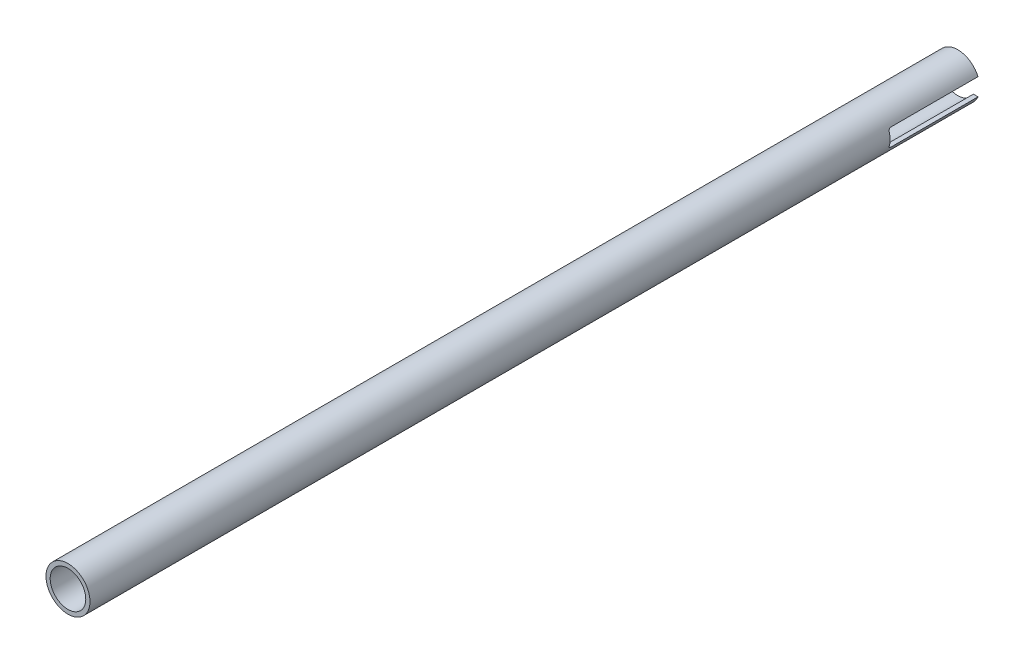
ISO-10303-21;
HEADER;
FILE_DESCRIPTION(('STEP AP214'),'2;1');
FILE_NAME('part.step','',(''),(''),'','','');
FILE_SCHEMA(('AUTOMOTIVE_DESIGN { 1 0 10303 214 1 1 1 1 }'));
ENDSEC;
DATA;
#1=APPLICATION_CONTEXT('core data for automotive mechanical design processes');
#2=APPLICATION_PROTOCOL_DEFINITION('international standard','automotive_design',2000,#1);
#3=PRODUCT_CONTEXT('',#1,'mechanical');
#4=PRODUCT('Part','Part','',(#3));
#5=PRODUCT_RELATED_PRODUCT_CATEGORY('part','',(#4));
#6=PRODUCT_DEFINITION_FORMATION('','',#4);
#7=PRODUCT_DEFINITION_CONTEXT('part definition',#1,'design');
#8=PRODUCT_DEFINITION('design','',#6,#7);
#9=PRODUCT_DEFINITION_SHAPE('','',#8);
#10=(LENGTH_UNIT() NAMED_UNIT(*) SI_UNIT(.MILLI.,.METRE.));
#11=(NAMED_UNIT(*) PLANE_ANGLE_UNIT() SI_UNIT($,.RADIAN.));
#12=(NAMED_UNIT(*) SI_UNIT($,.STERADIAN.) SOLID_ANGLE_UNIT());
#13=UNCERTAINTY_MEASURE_WITH_UNIT(LENGTH_MEASURE(1.E-05),#10,'distance_accuracy_value','');
#14=(GEOMETRIC_REPRESENTATION_CONTEXT(3) GLOBAL_UNCERTAINTY_ASSIGNED_CONTEXT((#13)) GLOBAL_UNIT_ASSIGNED_CONTEXT((#10,
#11,#12)) REPRESENTATION_CONTEXT('',''));
#15=CARTESIAN_POINT('',(0.,0.,0.));
#16=DIRECTION('',(0.,0.,1.));
#17=DIRECTION('',(1.,0.,0.));
#18=AXIS2_PLACEMENT_3D('',#15,#16,#17);
#19=CARTESIAN_POINT('',(0.,0.,0.));
#20=DIRECTION('',(0.,0.,1.));
#21=DIRECTION('',(1.,0.,0.));
#22=AXIS2_PLACEMENT_3D('',#19,#20,#21);
#23=PLANE('',#22);
#24=DIRECTION('',(-1.,0.,0.));
#25=VECTOR('',#24,1.);
#26=CARTESIAN_POINT('',(415.80090521024,-3.17500000000001,0.));
#27=LINE('',#26,#25);
#28=CARTESIAN_POINT('',(7.34407080575888,-3.17500000000001,0.));
#29=VERTEX_POINT('',#28);
#30=CARTESIAN_POINT('',(5.64543213580679,-3.17500000000001,0.));
#31=VERTEX_POINT('',#30);
#32=EDGE_CURVE('E70',#29,#31,#27,.T.);
#33=ORIENTED_EDGE('',*,*,#32,.F.);
#34=CARTESIAN_POINT('',(0.,0.,0.));
#35=DIRECTION('',(0.,0.,1.));
#36=DIRECTION('',(1.,0.,0.));
#37=AXIS2_PLACEMENT_3D('',#34,#35,#36);
#38=CIRCLE('',#37,8.001);
#39=CARTESIAN_POINT('',(-7.34407080575888,-3.17500000000001,0.));
#40=VERTEX_POINT('',#39);
#41=EDGE_CURVE('E161',#40,#29,#38,.T.);
#42=ORIENTED_EDGE('',*,*,#41,.F.);
#43=CARTESIAN_POINT('',(-5.64543213580676,-3.17500000000001,0.));
#44=VERTEX_POINT('',#43);
#45=EDGE_CURVE('E155',#44,#40,#27,.T.);
#46=ORIENTED_EDGE('',*,*,#45,.F.);
#47=CARTESIAN_POINT('',(0.,0.,0.));
#48=DIRECTION('',(0.,0.,1.));
#49=DIRECTION('',(1.,0.,0.));
#50=AXIS2_PLACEMENT_3D('',#47,#48,#49);
#51=CIRCLE('',#50,6.477);
#52=EDGE_CURVE('E266',#44,#31,#51,.T.);
#53=ORIENTED_EDGE('',*,*,#52,.T.);
#54=EDGE_LOOP('',(#33,#42,#46,#53));
#55=FACE_BOUND('',#54,.T.);
#56=ADVANCED_FACE('F45',(#55),#23,.F.);
#57=CARTESIAN_POINT('',(0.,0.,323.85));
#58=DIRECTION('',(0.,0.,-1.));
#59=DIRECTION('',(-1.,0.,0.));
#60=AXIS2_PLACEMENT_3D('',#57,#58,#59);
#61=CYLINDRICAL_SURFACE('',#60,8.001);
#62=CARTESIAN_POINT('',(0.,0.,323.85));
#63=DIRECTION('',(0.,0.,1.));
#64=DIRECTION('',(1.,0.,0.));
#65=AXIS2_PLACEMENT_3D('',#62,#63,#64);
#66=CIRCLE('',#65,8.001);
#67=CARTESIAN_POINT('',(8.001,0.,323.85));
#68=VERTEX_POINT('',#67);
#69=EDGE_CURVE('E275',#68,#68,#66,.T.);
#70=ORIENTED_EDGE('',*,*,#69,.F.);
#71=EDGE_LOOP('',(#70));
#72=FACE_BOUND('',#71,.T.);
#73=DIRECTION('',(0.,0.,-1.));
#74=VECTOR('',#73,1.);
#75=CARTESIAN_POINT('',(7.34407080575893,3.17499999999991,323.85));
#76=LINE('',#75,#74);
#77=CARTESIAN_POINT('',(7.34407080575894,3.175,0.));
#78=VERTEX_POINT('',#77);
#79=CARTESIAN_POINT('',(7.34407080575889,3.17499999999999,31.75));
#80=VERTEX_POINT('',#79);
#81=EDGE_CURVE('E260',#78,#80,#76,.F.);
#82=ORIENTED_EDGE('',*,*,#81,.F.);
#83=CARTESIAN_POINT('',(-7.34407080575894,3.175,0.));
#84=VERTEX_POINT('',#83);
#85=EDGE_CURVE('E280',#78,#84,#38,.T.);
#86=ORIENTED_EDGE('',*,*,#85,.T.);
#87=DIRECTION('',(0.,0.,-1.));
#88=VECTOR('',#87,1.);
#89=CARTESIAN_POINT('',(-7.34407080575893,3.17499999999991,323.85));
#90=LINE('',#89,#88);
#91=CARTESIAN_POINT('',(-7.34407080575889,3.17499999999999,31.75));
#92=VERTEX_POINT('',#91);
#93=EDGE_CURVE('E263',#92,#84,#90,.T.);
#94=ORIENTED_EDGE('',*,*,#93,.F.);
#95=CARTESIAN_POINT('',(-7.66747709484678,2.286,32.639));
#96=CARTESIAN_POINT('',(-7.65181817979908,2.3385958419998,32.6390275116819));
#97=CARTESIAN_POINT('',(-7.63558675167447,2.39098952207116,32.6343352251298));
#98=CARTESIAN_POINT('',(-7.60256503069519,2.49396025583239,32.6159066017238));
#99=CARTESIAN_POINT('',(-7.58577496211289,2.54453802198353,32.6021738536421));
#100=CARTESIAN_POINT('',(-7.55220768941947,2.64251174116497,32.5660580815029));
#101=CARTESIAN_POINT('',(-7.53543048621283,2.68990748772698,32.5436744967635));
#102=CARTESIAN_POINT('',(-7.50257725566912,2.78022296401813,32.4908109844895));
#103=CARTESIAN_POINT('',(-7.48650120499677,2.82314284277636,32.4603313266429));
#104=CARTESIAN_POINT('',(-7.45584332386721,2.9031425125085,32.3920404166692));
#105=CARTESIAN_POINT('',(-7.44125812173123,2.94023558815918,32.3542462937625));
#106=CARTESIAN_POINT('',(-7.41435240389723,3.00743958054121,32.2721647461423));
#107=CARTESIAN_POINT('',(-7.40203168420115,3.03755112627436,32.2278779069783));
#108=CARTESIAN_POINT('',(-7.38104682539323,3.08818112668983,32.1365340148327));
#109=CARTESIAN_POINT('',(-7.37222318574828,3.10912427794627,32.0897491729313));
#110=CARTESIAN_POINT('',(-7.35796584765575,3.14271825200318,31.9928425452802));
#111=CARTESIAN_POINT('',(-7.35252605118551,3.15538399361797,31.9427269434158));
#112=CARTESIAN_POINT('',(-7.34735234553181,3.1674009313941,31.8684048584009));
#113=CARTESIAN_POINT('',(-7.34612347725815,3.17024870486015,31.8448170364198));
#114=CARTESIAN_POINT('',(-7.34448285692754,3.17404712520643,31.7974907061118));
#115=CARTESIAN_POINT('',(-7.34407008630743,3.17500013692779,31.773752422764));
#116=CARTESIAN_POINT('',(-7.34407080575889,3.175,31.75));
#117=B_SPLINE_CURVE_WITH_KNOTS('',3,(#95,#96,#97,#98,#99,#100,#101,#102,#103,#104,#105,#106,
#107,#108,#109,#110,#111,#112,#113,#114,#115,#116),.UNSPECIFIED.,.F.,.F.,(4,2,2,2,2,2,2,2,2,2,
4),(0.,0.164387533439112,0.328709849636772,0.493042817755776,0.657370312474114,0.82131753786579,
0.985249986667357,1.14047233460427,1.29541413981368,1.36671002358172,1.43791686737052),.UNSPECIFIED.);
#118=CARTESIAN_POINT('',(-7.66747709484678,2.286,32.639));
#119=VERTEX_POINT('',#118);
#120=EDGE_CURVE('E246',#119,#92,#117,.T.);
#121=ORIENTED_EDGE('',*,*,#120,.F.);
#122=CARTESIAN_POINT('',(0.,0.,32.639));
#123=DIRECTION('',(0.,0.,-1.));
#124=DIRECTION('',(-1.,0.,0.));
#125=AXIS2_PLACEMENT_3D('',#122,#123,#124);
#126=CIRCLE('',#125,8.001);
#127=CARTESIAN_POINT('',(-7.66747709484678,-2.286,32.639));
#128=VERTEX_POINT('',#127);
#129=EDGE_CURVE('E148',#128,#119,#126,.T.);
#130=ORIENTED_EDGE('',*,*,#129,.F.);
#131=CARTESIAN_POINT('',(-7.34407080575888,-3.175,31.75));
#132=CARTESIAN_POINT('',(-7.34406971570972,-3.17500088370128,31.7736570858952));
#133=CARTESIAN_POINT('',(-7.34447940420715,-3.17405503965438,31.7973021074366));
#134=CARTESIAN_POINT('',(-7.34610625869457,-3.170288652398,31.8444082915399));
#135=CARTESIAN_POINT('',(-7.34732321350617,-3.16746859947543,31.867869500563));
#136=CARTESIAN_POINT('',(-7.35215076649045,-3.15625569034356,31.9375626709859));
#137=CARTESIAN_POINT('',(-7.35693830403215,-3.14510971897803,31.9833035467282));
#138=CARTESIAN_POINT('',(-7.36934349609523,-3.11593079737839,32.0720577142191));
#139=CARTESIAN_POINT('',(-7.37695964230854,-3.0979015174099,32.1150724453541));
#140=CARTESIAN_POINT('',(-7.39457927283179,-3.05560497402368,32.1974059965556));
#141=CARTESIAN_POINT('',(-7.40458417500077,-3.03133400515551,32.2367226021863));
#142=CARTESIAN_POINT('',(-7.42689980852546,-2.97625186370817,32.312267651995));
#143=CARTESIAN_POINT('',(-7.43928613165435,-2.945219850675,32.3483122722383));
#144=CARTESIAN_POINT('',(-7.46549476526876,-2.87813918144526,32.4147730668392));
#145=CARTESIAN_POINT('',(-7.47931759145999,-2.84208872203473,32.4451872088762));
#146=CARTESIAN_POINT('',(-7.50889078402754,-2.76305376052573,32.5018485874541));
#147=CARTESIAN_POINT('',(-7.52470809338404,-2.7197535354194,32.5276208374713));
#148=CARTESIAN_POINT('',(-7.55670403689051,-2.62954662067662,32.5714690498224));
#149=CARTESIAN_POINT('',(-7.57288263111192,-2.58264032819047,32.589545858256));
#150=CARTESIAN_POINT('',(-7.60238423763829,-2.49430278494766,32.6152662025405));
#151=CARTESIAN_POINT('',(-7.61574052170952,-2.4532348316008,32.6241344251313));
#152=CARTESIAN_POINT('',(-7.64200909447517,-2.37015408107822,32.6360040951805));
#153=CARTESIAN_POINT('',(-7.6549216806142,-2.32814194939098,32.6390095513723));
#154=CARTESIAN_POINT('',(-7.66747709484678,-2.286,32.639));
#155=B_SPLINE_CURVE_WITH_KNOTS('',3,(#131,#132,#133,#134,#135,#136,#137,#138,#139,#140,#141,
#142,#143,#144,#145,#146,#147,#148,#149,#150,#151,#152,#153,#154),.UNSPECIFIED.,.F.,.F.,(4,2,2,
2,2,2,2,2,2,2,2,4),(0.,0.070925236777886,0.141831927045324,0.283055205246197,0.424203286373198,
0.565435355900967,0.712257437161289,0.859132410947035,1.01687761832101,1.17460547741866,
1.30647213432676,1.43824859425632),.UNSPECIFIED.);
#156=CARTESIAN_POINT('',(-7.34407080575888,-3.175,31.75));
#157=VERTEX_POINT('',#156);
#158=EDGE_CURVE('E149',#157,#128,#155,.T.);
#159=ORIENTED_EDGE('',*,*,#158,.F.);
#160=DIRECTION('',(0.,0.,-1.));
#161=VECTOR('',#160,1.);
#162=CARTESIAN_POINT('',(-7.34407080575888,-3.17500000000001,323.85));
#163=LINE('',#162,#161);
#164=EDGE_CURVE('E163',#40,#157,#163,.F.);
#165=ORIENTED_EDGE('',*,*,#164,.F.);
#166=ORIENTED_EDGE('',*,*,#41,.T.);
#167=DIRECTION('',(0.,0.,-1.));
#168=VECTOR('',#167,1.);
#169=CARTESIAN_POINT('',(7.34407080575888,-3.17500000000001,323.85));
#170=LINE('',#169,#168);
#171=CARTESIAN_POINT('',(7.34407080575888,-3.175,31.75));
#172=VERTEX_POINT('',#171);
#173=EDGE_CURVE('E152',#172,#29,#170,.T.);
#174=ORIENTED_EDGE('',*,*,#173,.F.);
#175=CARTESIAN_POINT('',(7.66747709484678,-2.286,32.639));
#176=CARTESIAN_POINT('',(7.65181817979908,-2.3385958419998,32.6390275116819));
#177=CARTESIAN_POINT('',(7.63558675167447,-2.39098952207116,32.6343352251298));
#178=CARTESIAN_POINT('',(7.60256503069519,-2.49396025583239,32.6159066017238));
#179=CARTESIAN_POINT('',(7.58577496211289,-2.54453802198354,32.6021738536421));
#180=CARTESIAN_POINT('',(7.55220768941947,-2.64251174116498,32.566058081503));
#181=CARTESIAN_POINT('',(7.53543048621282,-2.68990748772699,32.5436744967635));
#182=CARTESIAN_POINT('',(7.50257725566912,-2.78022296401813,32.4908109844895));
#183=CARTESIAN_POINT('',(7.48650120499677,-2.82314284277637,32.4603313266429));
#184=CARTESIAN_POINT('',(7.45584332386721,-2.9031425125085,32.3920404166692));
#185=CARTESIAN_POINT('',(7.44125812173123,-2.94023558815918,32.3542462937625));
#186=CARTESIAN_POINT('',(7.41435240389723,-3.00743958054121,32.2721647461423));
#187=CARTESIAN_POINT('',(7.40203168420115,-3.03755112627436,32.2278779069783));
#188=CARTESIAN_POINT('',(7.38104682539323,-3.08818112668983,32.1365340148327));
#189=CARTESIAN_POINT('',(7.37222318574828,-3.10912427794628,32.0897491729313));
#190=CARTESIAN_POINT('',(7.35796584765574,-3.14271825200318,31.9928425452802));
#191=CARTESIAN_POINT('',(7.3525260511855,-3.15538399361798,31.9427269434158));
#192=CARTESIAN_POINT('',(7.34735234553181,-3.16740093139411,31.8684048584009));
#193=CARTESIAN_POINT('',(7.34612347725815,-3.17024870486016,31.8448170364198));
#194=CARTESIAN_POINT('',(7.34448285692754,-3.17404712520644,31.7974907061118));
#195=CARTESIAN_POINT('',(7.34407008630743,-3.1750001369278,31.773752422764));
#196=CARTESIAN_POINT('',(7.34407080575888,-3.175,31.75));
#197=B_SPLINE_CURVE_WITH_KNOTS('',3,(#175,#176,#177,#178,#179,#180,#181,#182,#183,#184,#185,
#186,#187,#188,#189,#190,#191,#192,#193,#194,#195,#196),.UNSPECIFIED.,.F.,.F.,(4,2,2,2,2,2,2,2,
2,2,4),(0.,0.164387533439115,0.328709849636773,0.493042817755783,0.657370312474119,
0.821317537865795,0.985249986667369,1.14047233460428,1.29541413981368,1.36671002358172,
1.43791686737054),.UNSPECIFIED.);
#198=CARTESIAN_POINT('',(7.66747709484678,-2.286,32.639));
#199=VERTEX_POINT('',#198);
#200=EDGE_CURVE('E137',#199,#172,#197,.T.);
#201=ORIENTED_EDGE('',*,*,#200,.F.);
#202=CARTESIAN_POINT('',(7.66747709484678,2.286,32.639));
#203=VERTEX_POINT('',#202);
#204=EDGE_CURVE('E253',#203,#199,#126,.T.);
#205=ORIENTED_EDGE('',*,*,#204,.F.);
#206=CARTESIAN_POINT('',(7.34407080575889,3.175,31.75));
#207=CARTESIAN_POINT('',(7.34406971570972,3.17500088370128,31.7736570858952));
#208=CARTESIAN_POINT('',(7.34447940420716,3.17405503965437,31.7973021074366));
#209=CARTESIAN_POINT('',(7.34610625869457,3.17028865239799,31.8444082915399));
#210=CARTESIAN_POINT('',(7.34732321350617,3.16746859947542,31.867869500563));
#211=CARTESIAN_POINT('',(7.35215076649045,3.15625569034355,31.9375626709859));
#212=CARTESIAN_POINT('',(7.35693830403215,3.14510971897802,31.9833035467282));
#213=CARTESIAN_POINT('',(7.36934349609523,3.11593079737838,32.0720577142191));
#214=CARTESIAN_POINT('',(7.37695964230854,3.0979015174099,32.1150724453541));
#215=CARTESIAN_POINT('',(7.39457927283179,3.05560497402368,32.1974059965556));
#216=CARTESIAN_POINT('',(7.40458417500077,3.0313340051555,32.2367226021863));
#217=CARTESIAN_POINT('',(7.42689980852546,2.97625186370817,32.312267651995));
#218=CARTESIAN_POINT('',(7.43928613165435,2.945219850675,32.3483122722383));
#219=CARTESIAN_POINT('',(7.46549476526876,2.87813918144526,32.4147730668392));
#220=CARTESIAN_POINT('',(7.47931759145999,2.84208872203474,32.4451872088762));
#221=CARTESIAN_POINT('',(7.50889078402754,2.76305376052573,32.5018485874541));
#222=CARTESIAN_POINT('',(7.52470809338403,2.7197535354194,32.5276208374712));
#223=CARTESIAN_POINT('',(7.55670403689051,2.62954662067663,32.5714690498224));
#224=CARTESIAN_POINT('',(7.57288263111192,2.58264032819047,32.589545858256));
#225=CARTESIAN_POINT('',(7.60238423763828,2.49430278494767,32.6152662025405));
#226=CARTESIAN_POINT('',(7.61574052170952,2.4532348316008,32.6241344251313));
#227=CARTESIAN_POINT('',(7.64200909447517,2.37015408107822,32.6360040951805));
#228=CARTESIAN_POINT('',(7.6549216806142,2.32814194939098,32.6390095513723));
#229=CARTESIAN_POINT('',(7.66747709484678,2.286,32.639));
#230=B_SPLINE_CURVE_WITH_KNOTS('',3,(#206,#207,#208,#209,#210,#211,#212,#213,#214,#215,#216,
#217,#218,#219,#220,#221,#222,#223,#224,#225,#226,#227,#228,#229),.UNSPECIFIED.,.F.,.F.,(4,2,2,
2,2,2,2,2,2,2,2,4),(0.,0.0709252367778859,0.141831927045324,0.28305520524619,0.424203286373189,
0.565435355900953,0.712257437161276,0.859132410947015,1.01687761832099,1.17460547741864,
1.30647213432675,1.43824859425631),.UNSPECIFIED.);
#231=EDGE_CURVE('E252',#80,#203,#230,.T.);
#232=ORIENTED_EDGE('',*,*,#231,.F.);
#233=EDGE_LOOP('',(#82,#86,#94,#121,#130,#159,#165,#166,#174,#201,#205,#232));
#234=FACE_BOUND('',#233,.T.);
#235=ADVANCED_FACE('F47',(#72,#234),#61,.T.);
#236=CARTESIAN_POINT('',(0.,0.,323.85));
#237=DIRECTION('',(0.,0.,-1.));
#238=DIRECTION('',(-1.,0.,0.));
#239=AXIS2_PLACEMENT_3D('',#236,#237,#238);
#240=CYLINDRICAL_SURFACE('',#239,6.477);
#241=CARTESIAN_POINT('',(0.,0.,323.85));
#242=DIRECTION('',(0.,0.,1.));
#243=DIRECTION('',(1.,0.,0.));
#244=AXIS2_PLACEMENT_3D('',#241,#242,#243);
#245=CIRCLE('',#244,6.477);
#246=CARTESIAN_POINT('',(6.477,0.,323.85));
#247=VERTEX_POINT('',#246);
#248=EDGE_CURVE('E267',#247,#247,#245,.T.);
#249=ORIENTED_EDGE('',*,*,#248,.T.);
#250=EDGE_LOOP('',(#249));
#251=FACE_BOUND('',#250,.T.);
#252=CARTESIAN_POINT('',(5.64543213580682,3.175,0.));
#253=VERTEX_POINT('',#252);
#254=CARTESIAN_POINT('',(-5.64543213580682,3.175,0.));
#255=VERTEX_POINT('',#254);
#256=EDGE_CURVE('E271',#253,#255,#51,.T.);
#257=ORIENTED_EDGE('',*,*,#256,.F.);
#258=DIRECTION('',(0.,0.,-1.));
#259=VECTOR('',#258,1.);
#260=CARTESIAN_POINT('',(5.64543213580684,3.17499999999991,323.85));
#261=LINE('',#260,#259);
#262=CARTESIAN_POINT('',(5.64543213580679,3.17499999999999,31.75));
#263=VERTEX_POINT('',#262);
#264=EDGE_CURVE('E11',#253,#263,#261,.F.);
#265=ORIENTED_EDGE('',*,*,#264,.T.);
#266=CARTESIAN_POINT('',(5.64543213580679,3.175,31.75));
#267=CARTESIAN_POINT('',(5.64543044042989,3.17500140585184,31.7729111533247));
#268=CARTESIAN_POINT('',(5.64593070004617,3.17411366158539,31.795810105589));
#269=CARTESIAN_POINT('',(5.64791480555353,3.17058252485039,31.8414204694065));
#270=CARTESIAN_POINT('',(5.64939826404815,3.16793982386273,31.8641319512591));
#271=CARTESIAN_POINT('',(5.65527201725278,3.15745067969402,31.9315204376351));
#272=CARTESIAN_POINT('',(5.6610861703082,3.14704261747344,31.9757061274198));
#273=CARTESIAN_POINT('',(5.67609012259666,3.11989839973904,32.0613776090719));
#274=CARTESIAN_POINT('',(5.6852760883171,3.10316943001822,32.1028664043091));
#275=CARTESIAN_POINT('',(5.70645315832375,3.06405204878679,32.18234212578));
#276=CARTESIAN_POINT('',(5.71844705360679,3.04165800456818,32.2203255150308));
#277=CARTESIAN_POINT('',(5.74538880639284,2.99047146151766,32.294225037511));
#278=CARTESIAN_POINT('',(5.760470355136,2.96137657634816,32.3298820015312));
#279=CARTESIAN_POINT('',(5.79235063902386,2.8985247096406,32.3959215223256));
#280=CARTESIAN_POINT('',(5.80915004263281,2.86476591143902,32.4263020133762));
#281=CARTESIAN_POINT('',(5.84585740684762,2.78916530636472,32.4846327638742));
#282=CARTESIAN_POINT('',(5.86589828681854,2.74683976532713,32.5118735132952));
#283=CARTESIAN_POINT('',(5.90649930896324,2.65841423879362,32.5587861461875));
#284=CARTESIAN_POINT('',(5.92705953088269,2.61231367117073,32.5784568596478));
#285=CARTESIAN_POINT('',(5.96680248159459,2.52014903366561,32.6089003130349));
#286=CARTESIAN_POINT('',(5.98599593912381,2.47423793596131,32.6201229715392));
#287=CARTESIAN_POINT('',(6.02371201705514,2.38096862814715,32.6351770159732));
#288=CARTESIAN_POINT('',(6.04223479309262,2.333610758533,32.6390101276148));
#289=CARTESIAN_POINT('',(6.0601759875436,2.286,32.639));
#290=B_SPLINE_CURVE_WITH_KNOTS('',3,(#266,#267,#268,#269,#270,#271,#272,#273,#274,#275,#276,
#277,#278,#279,#280,#281,#282,#283,#284,#285,#286,#287,#288,#289),.UNSPECIFIED.,.F.,.F.,(4,2,2,
2,2,2,2,2,2,2,2,4),(0.,0.068687196620181,0.137347345436104,0.27391429339755,0.410326452898889,
0.546874781976191,0.691582857305825,0.836347458342858,0.998190131113078,1.16005780795701,
1.31253695421091,1.46498048705331),.UNSPECIFIED.);
#291=CARTESIAN_POINT('',(6.0601759875436,2.286,32.639));
#292=VERTEX_POINT('',#291);
#293=EDGE_CURVE('E55',#263,#292,#290,.T.);
#294=ORIENTED_EDGE('',*,*,#293,.T.);
#295=CARTESIAN_POINT('',(0.,0.,32.639));
#296=DIRECTION('',(0.,0.,-1.));
#297=DIRECTION('',(-1.,0.,0.));
#298=AXIS2_PLACEMENT_3D('',#295,#296,#297);
#299=CIRCLE('',#298,6.477);
#300=CARTESIAN_POINT('',(6.0601759875436,-2.286,32.639));
#301=VERTEX_POINT('',#300);
#302=EDGE_CURVE('E208',#292,#301,#299,.T.);
#303=ORIENTED_EDGE('',*,*,#302,.T.);
#304=CARTESIAN_POINT('',(6.0601759875436,-2.286,32.639));
#305=CARTESIAN_POINT('',(6.03978081068774,-2.34014857959238,32.6390166782693));
#306=CARTESIAN_POINT('',(6.01862288999042,-2.39396256899493,32.6340558973563));
#307=CARTESIAN_POINT('',(5.97554062741139,-2.49951856179189,32.6146390126475));
#308=CARTESIAN_POINT('',(5.95361651732044,-2.55126118183464,32.6001857574097));
#309=CARTESIAN_POINT('',(5.90975299347153,-2.65129394394862,32.5622474688277));
#310=CARTESIAN_POINT('',(5.88781358456079,-2.69958489985616,32.5387645728857));
#311=CARTESIAN_POINT('',(5.84481116923183,-2.79146530798116,32.483283625047));
#312=CARTESIAN_POINT('',(5.82374830761314,-2.83505398529365,32.4512841726804));
#313=CARTESIAN_POINT('',(5.78358379236287,-2.91611611418946,32.3794456601217));
#314=CARTESIAN_POINT('',(5.76447805021855,-2.9536024146739,32.3396234720276));
#315=CARTESIAN_POINT('',(5.72936843402137,-3.02114519513562,32.2528888381434));
#316=CARTESIAN_POINT('',(5.71336340715089,-3.05120443757419,32.2059790390523));
#317=CARTESIAN_POINT('',(5.68692934999554,-3.10017317633139,32.1106440248017));
#318=CARTESIAN_POINT('',(5.67613806946751,-3.11982153707612,32.0626997879442));
#319=CARTESIAN_POINT('',(5.65913980967173,-3.15055256340769,31.9634270936088));
#320=CARTESIAN_POINT('',(5.65292059099913,-3.16165810184863,31.9121080751244));
#321=CARTESIAN_POINT('',(5.64799850196717,-3.17043304623078,31.8418735973658));
#322=CARTESIAN_POINT('',(5.64703706100548,-3.17214484120853,31.8235437472827));
#323=CARTESIAN_POINT('',(5.64575449506273,-3.17442705985285,31.786812818975));
#324=CARTESIAN_POINT('',(5.64543260742236,-3.17499884297207,31.7684118518371));
#325=CARTESIAN_POINT('',(5.64543213580706,-3.17500000000004,31.75));
#326=B_SPLINE_CURVE_WITH_KNOTS('',3,(#304,#305,#306,#307,#308,#309,#310,#311,#312,#313,#314,
#315,#316,#317,#318,#319,#320,#321,#322,#323,#324,#325),.UNSPECIFIED.,.F.,.F.,(4,2,2,2,2,2,2,2,
2,2,4),(0.,0.1733092716716,0.34656655941604,0.519782860726129,0.693027663492769,
0.865902834595405,1.0387136084211,1.19659592791202,1.3540540420246,1.40932231319344,
1.46452463799272),.UNSPECIFIED.);
#327=CARTESIAN_POINT('',(5.64543213580676,-3.175,31.75));
#328=VERTEX_POINT('',#327);
#329=EDGE_CURVE('E201',#301,#328,#326,.T.);
#330=ORIENTED_EDGE('',*,*,#329,.T.);
#331=DIRECTION('',(0.,0.,-1.));
#332=VECTOR('',#331,1.);
#333=CARTESIAN_POINT('',(5.64543213580679,-3.17500000000001,323.85));
#334=LINE('',#333,#332);
#335=EDGE_CURVE('E153',#328,#31,#334,.T.);
#336=ORIENTED_EDGE('',*,*,#335,.T.);
#337=ORIENTED_EDGE('',*,*,#52,.F.);
#338=DIRECTION('',(0.,0.,-1.));
#339=VECTOR('',#338,1.);
#340=CARTESIAN_POINT('',(-5.64543213580679,-3.17500000000001,323.85));
#341=LINE('',#340,#339);
#342=CARTESIAN_POINT('',(-5.64543213580679,-3.17500000000001,31.75));
#343=VERTEX_POINT('',#342);
#344=EDGE_CURVE('E279',#44,#343,#341,.F.);
#345=ORIENTED_EDGE('',*,*,#344,.T.);
#346=CARTESIAN_POINT('',(-5.64543213580679,-3.175,31.75));
#347=CARTESIAN_POINT('',(-5.64543044042988,-3.17500140585185,31.7729111533247));
#348=CARTESIAN_POINT('',(-5.64593070004617,-3.1741136615854,31.795810105589));
#349=CARTESIAN_POINT('',(-5.64791480555353,-3.17058252485039,31.8414204694065));
#350=CARTESIAN_POINT('',(-5.64939826404815,-3.16793982386274,31.8641319512591));
#351=CARTESIAN_POINT('',(-5.65527201725278,-3.15745067969403,31.9315204376351));
#352=CARTESIAN_POINT('',(-5.6610861703082,-3.14704261747345,31.9757061274198));
#353=CARTESIAN_POINT('',(-5.67609012259666,-3.11989839973905,32.0613776090719));
#354=CARTESIAN_POINT('',(-5.6852760883171,-3.10316943001823,32.1028664043091));
#355=CARTESIAN_POINT('',(-5.70645315832375,-3.0640520487868,32.18234212578));
#356=CARTESIAN_POINT('',(-5.71844705360679,-3.04165800456819,32.2203255150308));
#357=CARTESIAN_POINT('',(-5.74538880639284,-2.99047146151766,32.2942250375111));
#358=CARTESIAN_POINT('',(-5.760470355136,-2.96137657634816,32.3298820015312));
#359=CARTESIAN_POINT('',(-5.79235063902386,-2.89852470964059,32.3959215223256));
#360=CARTESIAN_POINT('',(-5.80915004263282,-2.86476591143901,32.4263020133762));
#361=CARTESIAN_POINT('',(-5.84585740684762,-2.78916530636471,32.4846327638742));
#362=CARTESIAN_POINT('',(-5.86589828681854,-2.74683976532712,32.5118735132952));
#363=CARTESIAN_POINT('',(-5.90649930896325,-2.65841423879361,32.5587861461875));
#364=CARTESIAN_POINT('',(-5.92705953088269,-2.61231367117072,32.5784568596478));
#365=CARTESIAN_POINT('',(-5.96680248159459,-2.5201490336656,32.6089003130349));
#366=CARTESIAN_POINT('',(-5.98599593912382,-2.47423793596131,32.6201229715392));
#367=CARTESIAN_POINT('',(-6.02371201705515,-2.38096862814715,32.6351770159732));
#368=CARTESIAN_POINT('',(-6.04223479309262,-2.333610758533,32.6390101276148));
#369=CARTESIAN_POINT('',(-6.0601759875436,-2.286,32.639));
#370=B_SPLINE_CURVE_WITH_KNOTS('',3,(#346,#347,#348,#349,#350,#351,#352,#353,#354,#355,#356,
#357,#358,#359,#360,#361,#362,#363,#364,#365,#366,#367,#368,#369),.UNSPECIFIED.,.F.,.F.,(4,2,2,
2,2,2,2,2,2,2,2,4),(0.,0.068687196620181,0.137347345436104,0.273914293397557,0.410326452898889,
0.546874781976208,0.691582857305843,0.836347458342877,0.9981901311131,1.16005780795703,
1.31253695421093,1.46498048705332),.UNSPECIFIED.);
#371=CARTESIAN_POINT('',(-6.0601759875436,-2.286,32.639));
#372=VERTEX_POINT('',#371);
#373=EDGE_CURVE('E191',#343,#372,#370,.T.);
#374=ORIENTED_EDGE('',*,*,#373,.T.);
#375=CARTESIAN_POINT('',(-6.0601759875436,2.286,32.639));
#376=VERTEX_POINT('',#375);
#377=EDGE_CURVE('E234',#372,#376,#299,.T.);
#378=ORIENTED_EDGE('',*,*,#377,.T.);
#379=CARTESIAN_POINT('',(-6.0601759875436,2.286,32.639));
#380=CARTESIAN_POINT('',(-6.03978081068774,2.34014857959238,32.6390166782693));
#381=CARTESIAN_POINT('',(-6.01862288999042,2.39396256899493,32.6340558973563));
#382=CARTESIAN_POINT('',(-5.97554062741139,2.49951856179189,32.6146390126475));
#383=CARTESIAN_POINT('',(-5.95361651732045,2.55126118183463,32.6001857574097));
#384=CARTESIAN_POINT('',(-5.90975299347153,2.65129394394862,32.5622474688277));
#385=CARTESIAN_POINT('',(-5.88781358456079,2.69958489985616,32.5387645728857));
#386=CARTESIAN_POINT('',(-5.84481116923184,2.79146530798116,32.483283625047));
#387=CARTESIAN_POINT('',(-5.82374830761314,2.83505398529365,32.4512841726804));
#388=CARTESIAN_POINT('',(-5.78358379236287,2.91611611418945,32.3794456601217));
#389=CARTESIAN_POINT('',(-5.76447805021856,2.9536024146739,32.3396234720276));
#390=CARTESIAN_POINT('',(-5.72936843402137,3.02114519513561,32.2528888381434));
#391=CARTESIAN_POINT('',(-5.71336340715089,3.05120443757418,32.2059790390523));
#392=CARTESIAN_POINT('',(-5.68692934999554,3.10017317633138,32.1106440248017));
#393=CARTESIAN_POINT('',(-5.67613806946751,3.11982153707611,32.0626997879442));
#394=CARTESIAN_POINT('',(-5.65913980967173,3.15055256340768,31.9634270936088));
#395=CARTESIAN_POINT('',(-5.65292059099914,3.16165810184862,31.9121080751244));
#396=CARTESIAN_POINT('',(-5.64799850196718,3.17043304623077,31.8418735973658));
#397=CARTESIAN_POINT('',(-5.64703706100549,3.17214484120852,31.8235437472827));
#398=CARTESIAN_POINT('',(-5.64575449506273,3.17442705985284,31.786812818975));
#399=CARTESIAN_POINT('',(-5.64543260742236,3.17499884297207,31.7684118518371));
#400=CARTESIAN_POINT('',(-5.64543213580706,3.17500000000003,31.75));
#401=B_SPLINE_CURVE_WITH_KNOTS('',3,(#379,#380,#381,#382,#383,#384,#385,#386,#387,#388,#389,
#390,#391,#392,#393,#394,#395,#396,#397,#398,#399,#400),.UNSPECIFIED.,.F.,.F.,(4,2,2,2,2,2,2,2,
2,2,4),(0.,0.173309271671598,0.346566559416038,0.519782860726123,0.693027663492763,
0.8659028345954,1.0387136084211,1.19659592791201,1.35405404202459,1.40932231319342,
1.46452463799271),.UNSPECIFIED.);
#402=CARTESIAN_POINT('',(-5.64543213580679,3.17499999999999,31.75));
#403=VERTEX_POINT('',#402);
#404=EDGE_CURVE('E226',#376,#403,#401,.T.);
#405=ORIENTED_EDGE('',*,*,#404,.T.);
#406=DIRECTION('',(0.,0.,-1.));
#407=VECTOR('',#406,1.);
#408=CARTESIAN_POINT('',(-5.64543213580684,3.17499999999991,323.85));
#409=LINE('',#408,#407);
#410=EDGE_CURVE('E233',#403,#255,#409,.T.);
#411=ORIENTED_EDGE('',*,*,#410,.T.);
#412=EDGE_LOOP('',(#257,#265,#294,#303,#330,#336,#337,#345,#374,#378,#405,#411));
#413=FACE_BOUND('',#412,.T.);
#414=ADVANCED_FACE('F214',(#251,#413),#240,.F.);
#415=CARTESIAN_POINT('',(0.,0.,323.85));
#416=DIRECTION('',(0.,0.,1.));
#417=DIRECTION('',(1.,0.,0.));
#418=AXIS2_PLACEMENT_3D('',#415,#416,#417);
#419=PLANE('',#418);
#420=ORIENTED_EDGE('',*,*,#69,.T.);
#421=EDGE_LOOP('',(#420));
#422=FACE_BOUND('',#421,.T.);
#423=ORIENTED_EDGE('',*,*,#248,.F.);
#424=EDGE_LOOP('',(#423));
#425=FACE_BOUND('',#424,.T.);
#426=ADVANCED_FACE('F219',(#422,#425),#419,.T.);
#427=ORIENTED_EDGE('',*,*,#85,.F.);
#428=DIRECTION('',(-1.,0.,0.));
#429=VECTOR('',#428,1.);
#430=CARTESIAN_POINT('',(415.80090521024,3.175,0.));
#431=LINE('',#430,#429);
#432=EDGE_CURVE('E168',#78,#253,#431,.T.);
#433=ORIENTED_EDGE('',*,*,#432,.T.);
#434=ORIENTED_EDGE('',*,*,#256,.T.);
#435=EDGE_CURVE('E306',#255,#84,#431,.T.);
#436=ORIENTED_EDGE('',*,*,#435,.T.);
#437=EDGE_LOOP('',(#427,#433,#434,#436));
#438=FACE_BOUND('',#437,.T.);
#439=ADVANCED_FACE('F345',(#438),#23,.F.);
#440=CARTESIAN_POINT('',(415.80090521024,-3.17500000000001,31.75));
#441=DIRECTION('',(0.,1.,0.));
#442=DIRECTION('',(0.,0.,1.));
#443=AXIS2_PLACEMENT_3D('',#440,#441,#442);
#444=PLANE('',#443);
#445=ORIENTED_EDGE('',*,*,#45,.T.);
#446=ORIENTED_EDGE('',*,*,#164,.T.);
#447=DIRECTION('',(-1.,0.,0.));
#448=VECTOR('',#447,1.);
#449=CARTESIAN_POINT('',(415.80090521024,-3.175,31.75));
#450=LINE('',#449,#448);
#451=EDGE_CURVE('E62',#343,#157,#450,.T.);
#452=ORIENTED_EDGE('',*,*,#451,.F.);
#453=ORIENTED_EDGE('',*,*,#344,.F.);
#454=EDGE_LOOP('',(#445,#446,#452,#453));
#455=FACE_BOUND('',#454,.T.);
#456=ADVANCED_FACE('F359',(#455),#444,.T.);
#457=CARTESIAN_POINT('',(415.80090521024,-2.286,31.75));
#458=DIRECTION('',(-1.,0.,0.));
#459=DIRECTION('',(0.,0.,1.));
#460=AXIS2_PLACEMENT_3D('',#457,#458,#459);
#461=CYLINDRICAL_SURFACE('',#460,0.889000000000003);
#462=ORIENTED_EDGE('',*,*,#451,.T.);
#463=ORIENTED_EDGE('',*,*,#158,.T.);
#464=DIRECTION('',(-1.,0.,0.));
#465=VECTOR('',#464,1.);
#466=CARTESIAN_POINT('',(415.80090521024,-2.286,32.639));
#467=LINE('',#466,#465);
#468=EDGE_CURVE('E318',#372,#128,#467,.T.);
#469=ORIENTED_EDGE('',*,*,#468,.F.);
#470=ORIENTED_EDGE('',*,*,#373,.F.);
#471=EDGE_LOOP('',(#462,#463,#469,#470));
#472=FACE_BOUND('',#471,.T.);
#473=ADVANCED_FACE('F186',(#472),#461,.F.);
#474=CARTESIAN_POINT('',(415.80090521024,2.286,32.639));
#475=DIRECTION('',(0.,0.,-1.));
#476=DIRECTION('',(-1.,0.,0.));
#477=AXIS2_PLACEMENT_3D('',#474,#475,#476);
#478=PLANE('',#477);
#479=ORIENTED_EDGE('',*,*,#468,.T.);
#480=ORIENTED_EDGE('',*,*,#129,.T.);
#481=DIRECTION('',(-1.,0.,0.));
#482=VECTOR('',#481,1.);
#483=CARTESIAN_POINT('',(415.80090521024,2.286,32.639));
#484=LINE('',#483,#482);
#485=EDGE_CURVE('E314',#376,#119,#484,.T.);
#486=ORIENTED_EDGE('',*,*,#485,.F.);
#487=ORIENTED_EDGE('',*,*,#377,.F.);
#488=EDGE_LOOP('',(#479,#480,#486,#487));
#489=FACE_BOUND('',#488,.T.);
#490=ADVANCED_FACE('F334',(#489),#478,.T.);
#491=CARTESIAN_POINT('',(415.80090521024,2.286,31.75));
#492=DIRECTION('',(-1.,0.,0.));
#493=DIRECTION('',(0.,0.,1.));
#494=AXIS2_PLACEMENT_3D('',#491,#492,#493);
#495=CYLINDRICAL_SURFACE('',#494,0.888999999999996);
#496=ORIENTED_EDGE('',*,*,#485,.T.);
#497=ORIENTED_EDGE('',*,*,#120,.T.);
#498=DIRECTION('',(-1.,0.,0.));
#499=VECTOR('',#498,1.);
#500=CARTESIAN_POINT('',(415.80090521024,3.17499999999999,31.75));
#501=LINE('',#500,#499);
#502=EDGE_CURVE('E307',#403,#92,#501,.T.);
#503=ORIENTED_EDGE('',*,*,#502,.F.);
#504=ORIENTED_EDGE('',*,*,#404,.F.);
#505=EDGE_LOOP('',(#496,#497,#503,#504));
#506=FACE_BOUND('',#505,.T.);
#507=ADVANCED_FACE('F240',(#506),#495,.F.);
#508=CARTESIAN_POINT('',(415.80090521024,3.175,0.));
#509=DIRECTION('',(0.,-1.,0.));
#510=DIRECTION('',(0.,0.,-1.));
#511=AXIS2_PLACEMENT_3D('',#508,#509,#510);
#512=PLANE('',#511);
#513=ORIENTED_EDGE('',*,*,#502,.T.);
#514=ORIENTED_EDGE('',*,*,#93,.T.);
#515=ORIENTED_EDGE('',*,*,#435,.F.);
#516=ORIENTED_EDGE('',*,*,#410,.F.);
#517=EDGE_LOOP('',(#513,#514,#515,#516));
#518=FACE_BOUND('',#517,.T.);
#519=ADVANCED_FACE('F221',(#518),#512,.T.);
#520=ORIENTED_EDGE('',*,*,#432,.F.);
#521=ORIENTED_EDGE('',*,*,#81,.T.);
#522=EDGE_CURVE('E299',#80,#263,#501,.T.);
#523=ORIENTED_EDGE('',*,*,#522,.T.);
#524=ORIENTED_EDGE('',*,*,#264,.F.);
#525=EDGE_LOOP('',(#520,#521,#523,#524));
#526=FACE_BOUND('',#525,.T.);
#527=ADVANCED_FACE('F238',(#526),#512,.T.);
#528=ORIENTED_EDGE('',*,*,#522,.F.);
#529=ORIENTED_EDGE('',*,*,#231,.T.);
#530=EDGE_CURVE('E302',#203,#292,#484,.T.);
#531=ORIENTED_EDGE('',*,*,#530,.T.);
#532=ORIENTED_EDGE('',*,*,#293,.F.);
#533=EDGE_LOOP('',(#528,#529,#531,#532));
#534=FACE_BOUND('',#533,.T.);
#535=ADVANCED_FACE('F235',(#534),#495,.F.);
#536=ORIENTED_EDGE('',*,*,#530,.F.);
#537=ORIENTED_EDGE('',*,*,#204,.T.);
#538=EDGE_CURVE('E143',#199,#301,#467,.T.);
#539=ORIENTED_EDGE('',*,*,#538,.T.);
#540=ORIENTED_EDGE('',*,*,#302,.F.);
#541=EDGE_LOOP('',(#536,#537,#539,#540));
#542=FACE_BOUND('',#541,.T.);
#543=ADVANCED_FACE('F185',(#542),#478,.T.);
#544=ORIENTED_EDGE('',*,*,#538,.F.);
#545=ORIENTED_EDGE('',*,*,#200,.T.);
#546=EDGE_CURVE('E140',#172,#328,#450,.T.);
#547=ORIENTED_EDGE('',*,*,#546,.T.);
#548=ORIENTED_EDGE('',*,*,#329,.F.);
#549=EDGE_LOOP('',(#544,#545,#547,#548));
#550=FACE_BOUND('',#549,.T.);
#551=ADVANCED_FACE('F139',(#550),#461,.F.);
#552=ORIENTED_EDGE('',*,*,#546,.F.);
#553=ORIENTED_EDGE('',*,*,#173,.T.);
#554=ORIENTED_EDGE('',*,*,#32,.T.);
#555=ORIENTED_EDGE('',*,*,#335,.F.);
#556=EDGE_LOOP('',(#552,#553,#554,#555));
#557=FACE_BOUND('',#556,.T.);
#558=ADVANCED_FACE('F151',(#557),#444,.T.);
#559=CLOSED_SHELL('',(#56,#235,#414,#426,#439,#456,#473,#490,#507,#519,#527,#535,#543,#551,#558));
#560=MANIFOLD_SOLID_BREP('B2',#559);
#561=ADVANCED_BREP_SHAPE_REPRESENTATION('',(#18,#560),#14);
#562=SHAPE_DEFINITION_REPRESENTATION(#9,#561);
ENDSEC;
END-ISO-10303-21;
